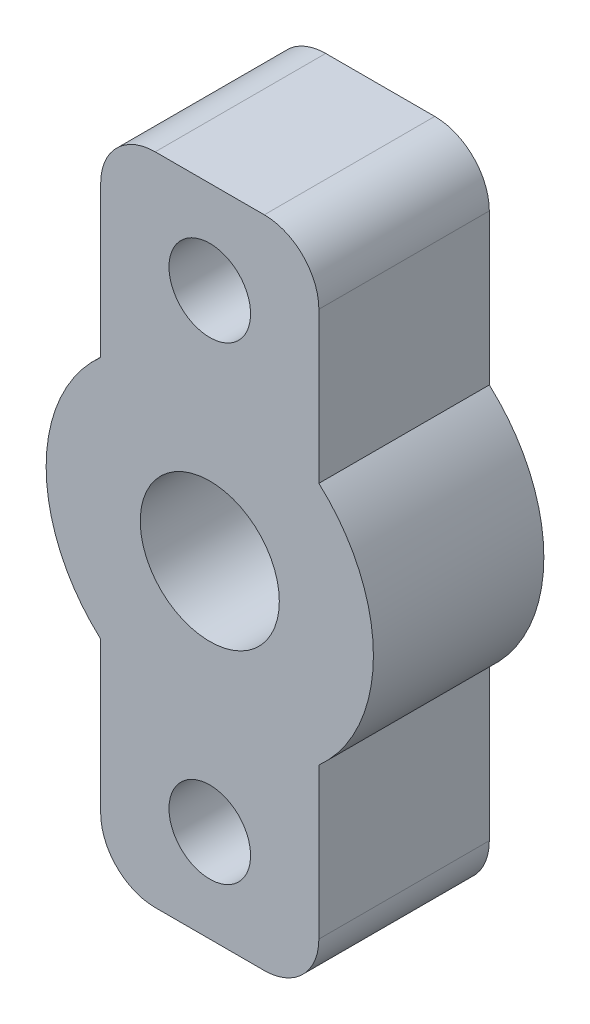
ISO-10303-21;
HEADER;
FILE_DESCRIPTION(('STEP AP214'),'2;1');
FILE_NAME('part.step','',(''),(''),'','','');
FILE_SCHEMA(('AUTOMOTIVE_DESIGN { 1 0 10303 214 1 1 1 1 }'));
ENDSEC;
DATA;
#1=APPLICATION_CONTEXT('core data for automotive mechanical design processes');
#2=APPLICATION_PROTOCOL_DEFINITION('international standard','automotive_design',2000,#1);
#3=PRODUCT_CONTEXT('',#1,'mechanical');
#4=PRODUCT('Part','Part','',(#3));
#5=PRODUCT_RELATED_PRODUCT_CATEGORY('part','',(#4));
#6=PRODUCT_DEFINITION_FORMATION('','',#4);
#7=PRODUCT_DEFINITION_CONTEXT('part definition',#1,'design');
#8=PRODUCT_DEFINITION('design','',#6,#7);
#9=PRODUCT_DEFINITION_SHAPE('','',#8);
#10=(LENGTH_UNIT() NAMED_UNIT(*) SI_UNIT(.MILLI.,.METRE.));
#11=(NAMED_UNIT(*) PLANE_ANGLE_UNIT() SI_UNIT($,.RADIAN.));
#12=(NAMED_UNIT(*) SI_UNIT($,.STERADIAN.) SOLID_ANGLE_UNIT());
#13=UNCERTAINTY_MEASURE_WITH_UNIT(LENGTH_MEASURE(1.E-05),#10,'distance_accuracy_value','');
#14=(GEOMETRIC_REPRESENTATION_CONTEXT(3) GLOBAL_UNCERTAINTY_ASSIGNED_CONTEXT((#13)) GLOBAL_UNIT_ASSIGNED_CONTEXT((#10,
#11,#12)) REPRESENTATION_CONTEXT('',''));
#15=CARTESIAN_POINT('',(0.,0.,0.));
#16=DIRECTION('',(0.,0.,1.));
#17=DIRECTION('',(1.,0.,0.));
#18=AXIS2_PLACEMENT_3D('',#15,#16,#17);
#19=CARTESIAN_POINT('',(2.54,12.7,7.9375));
#20=DIRECTION('',(0.,0.,1.));
#21=DIRECTION('',(1.,0.,0.));
#22=AXIS2_PLACEMENT_3D('',#19,#20,#21);
#23=PLANE('',#22);
#24=CARTESIAN_POINT('',(0.,0.,7.9375));
#25=DIRECTION('',(0.,0.,1.));
#26=DIRECTION('',(1.,0.,0.));
#27=AXIS2_PLACEMENT_3D('',#24,#25,#26);
#28=CIRCLE('',#27,3.2385);
#29=CARTESIAN_POINT('',(3.2385,0.,7.9375));
#30=VERTEX_POINT('',#29);
#31=EDGE_CURVE('E283',#30,#30,#28,.T.);
#32=ORIENTED_EDGE('',*,*,#31,.F.);
#33=EDGE_LOOP('',(#32));
#34=FACE_BOUND('',#33,.T.);
#35=CARTESIAN_POINT('',(2.54,12.7,7.9375));
#36=DIRECTION('',(0.,0.,1.));
#37=DIRECTION('',(1.,0.,0.));
#38=AXIS2_PLACEMENT_3D('',#35,#36,#37);
#39=CIRCLE('',#38,2.54);
#40=CARTESIAN_POINT('',(5.08,12.7,7.9375));
#41=VERTEX_POINT('',#40);
#42=CARTESIAN_POINT('',(2.53999999999998,15.24,7.9375));
#43=VERTEX_POINT('',#42);
#44=EDGE_CURVE('E180',#41,#43,#39,.T.);
#45=ORIENTED_EDGE('',*,*,#44,.T.);
#46=DIRECTION('',(-1.,0.,0.));
#47=VECTOR('',#46,1.);
#48=CARTESIAN_POINT('',(-2.53999999999998,15.24,7.9375));
#49=LINE('',#48,#47);
#50=CARTESIAN_POINT('',(-2.53999999999998,15.24,7.9375));
#51=VERTEX_POINT('',#50);
#52=EDGE_CURVE('E108',#43,#51,#49,.T.);
#53=ORIENTED_EDGE('',*,*,#52,.T.);
#54=CARTESIAN_POINT('',(-2.54,12.7,7.9375));
#55=DIRECTION('',(0.,0.,1.));
#56=DIRECTION('',(1.,0.,0.));
#57=AXIS2_PLACEMENT_3D('',#54,#55,#56);
#58=CIRCLE('',#57,2.54);
#59=CARTESIAN_POINT('',(-5.08,12.7,7.9375));
#60=VERTEX_POINT('',#59);
#61=EDGE_CURVE('E207',#51,#60,#58,.T.);
#62=ORIENTED_EDGE('',*,*,#61,.T.);
#63=DIRECTION('',(0.,-1.,0.));
#64=VECTOR('',#63,1.);
#65=CARTESIAN_POINT('',(-5.08,12.7,7.9375));
#66=LINE('',#65,#64);
#67=CARTESIAN_POINT('',(-5.08,5.67961266284947,7.9375));
#68=VERTEX_POINT('',#67);
#69=EDGE_CURVE('E226',#60,#68,#66,.T.);
#70=ORIENTED_EDGE('',*,*,#69,.T.);
#71=CARTESIAN_POINT('',(0.,0.,7.9375));
#72=DIRECTION('',(0.,0.,1.));
#73=DIRECTION('',(1.,0.,0.));
#74=AXIS2_PLACEMENT_3D('',#71,#72,#73);
#75=CIRCLE('',#74,7.62);
#76=CARTESIAN_POINT('',(-5.07999999999999,-5.67961266284947,7.9375));
#77=VERTEX_POINT('',#76);
#78=EDGE_CURVE('E223',#68,#77,#75,.T.);
#79=ORIENTED_EDGE('',*,*,#78,.T.);
#80=DIRECTION('',(0.,-1.,0.));
#81=VECTOR('',#80,1.);
#82=CARTESIAN_POINT('',(-5.08,-12.7,7.9375));
#83=LINE('',#82,#81);
#84=CARTESIAN_POINT('',(-5.08,-12.7,7.9375));
#85=VERTEX_POINT('',#84);
#86=EDGE_CURVE('E225',#77,#85,#83,.T.);
#87=ORIENTED_EDGE('',*,*,#86,.T.);
#88=CARTESIAN_POINT('',(-2.54,-12.7,7.9375));
#89=DIRECTION('',(0.,0.,1.));
#90=DIRECTION('',(-1.,0.,0.));
#91=AXIS2_PLACEMENT_3D('',#88,#89,#90);
#92=CIRCLE('',#91,2.54);
#93=CARTESIAN_POINT('',(-2.53999999999998,-15.24,7.9375));
#94=VERTEX_POINT('',#93);
#95=EDGE_CURVE('E228',#85,#94,#92,.T.);
#96=ORIENTED_EDGE('',*,*,#95,.T.);
#97=DIRECTION('',(1.,0.,0.));
#98=VECTOR('',#97,1.);
#99=CARTESIAN_POINT('',(-2.53999999999998,-15.24,7.9375));
#100=LINE('',#99,#98);
#101=CARTESIAN_POINT('',(2.53999999999998,-15.24,7.9375));
#102=VERTEX_POINT('',#101);
#103=EDGE_CURVE('E234',#94,#102,#100,.T.);
#104=ORIENTED_EDGE('',*,*,#103,.T.);
#105=CARTESIAN_POINT('',(2.54,-12.7,7.9375));
#106=DIRECTION('',(0.,0.,1.));
#107=DIRECTION('',(-1.,0.,0.));
#108=AXIS2_PLACEMENT_3D('',#105,#106,#107);
#109=CIRCLE('',#108,2.54);
#110=CARTESIAN_POINT('',(5.08,-12.7,7.9375));
#111=VERTEX_POINT('',#110);
#112=EDGE_CURVE('E139',#102,#111,#109,.T.);
#113=ORIENTED_EDGE('',*,*,#112,.T.);
#114=DIRECTION('',(0.,1.,0.));
#115=VECTOR('',#114,1.);
#116=CARTESIAN_POINT('',(5.08,-12.7,7.9375));
#117=LINE('',#116,#115);
#118=CARTESIAN_POINT('',(5.08,-5.67961266284946,7.9375));
#119=VERTEX_POINT('',#118);
#120=EDGE_CURVE('E133',#111,#119,#117,.T.);
#121=ORIENTED_EDGE('',*,*,#120,.T.);
#122=CARTESIAN_POINT('',(0.,0.,7.9375));
#123=DIRECTION('',(0.,0.,1.));
#124=DIRECTION('',(1.,0.,0.));
#125=AXIS2_PLACEMENT_3D('',#122,#123,#124);
#126=CIRCLE('',#125,7.62);
#127=CARTESIAN_POINT('',(5.08,5.67961266284946,7.9375));
#128=VERTEX_POINT('',#127);
#129=EDGE_CURVE('E137',#119,#128,#126,.T.);
#130=ORIENTED_EDGE('',*,*,#129,.T.);
#131=DIRECTION('',(0.,1.,0.));
#132=VECTOR('',#131,1.);
#133=CARTESIAN_POINT('',(5.08,12.7,7.9375));
#134=LINE('',#133,#132);
#135=EDGE_CURVE('E53',#128,#41,#134,.T.);
#136=ORIENTED_EDGE('',*,*,#135,.T.);
#137=EDGE_LOOP('',(#45,#53,#62,#70,#79,#87,#96,#104,#113,#121,#130,#136));
#138=FACE_BOUND('',#137,.T.);
#139=CARTESIAN_POINT('',(0.,10.922,7.9375));
#140=DIRECTION('',(0.,0.,-1.));
#141=DIRECTION('',(-1.,0.,0.));
#142=AXIS2_PLACEMENT_3D('',#139,#140,#141);
#143=CIRCLE('',#142,1.9);
#144=CARTESIAN_POINT('',(-1.9,10.922,7.9375));
#145=VERTEX_POINT('',#144);
#146=EDGE_CURVE('E161',#145,#145,#143,.T.);
#147=ORIENTED_EDGE('',*,*,#146,.T.);
#148=EDGE_LOOP('',(#147));
#149=FACE_BOUND('',#148,.T.);
#150=CARTESIAN_POINT('',(0.,-10.922,7.9375));
#151=DIRECTION('',(0.,0.,1.));
#152=DIRECTION('',(-1.,0.,0.));
#153=AXIS2_PLACEMENT_3D('',#150,#151,#152);
#154=CIRCLE('',#153,1.9);
#155=CARTESIAN_POINT('',(-1.9,-10.922,7.9375));
#156=VERTEX_POINT('',#155);
#157=EDGE_CURVE('E288',#156,#156,#154,.T.);
#158=ORIENTED_EDGE('',*,*,#157,.F.);
#159=EDGE_LOOP('',(#158));
#160=FACE_BOUND('',#159,.T.);
#161=ADVANCED_FACE('F36',(#34,#138,#149,#160),#23,.T.);
#162=CARTESIAN_POINT('',(2.54,12.7,0.));
#163=DIRECTION('',(0.,0.,1.));
#164=DIRECTION('',(1.,0.,0.));
#165=AXIS2_PLACEMENT_3D('',#162,#163,#164);
#166=PLANE('',#165);
#167=CARTESIAN_POINT('',(0.,0.,0.));
#168=DIRECTION('',(0.,0.,1.));
#169=DIRECTION('',(1.,0.,0.));
#170=AXIS2_PLACEMENT_3D('',#167,#168,#169);
#171=CIRCLE('',#170,3.2385);
#172=CARTESIAN_POINT('',(3.2385,0.,0.));
#173=VERTEX_POINT('',#172);
#174=EDGE_CURVE('E281',#173,#173,#171,.T.);
#175=ORIENTED_EDGE('',*,*,#174,.T.);
#176=EDGE_LOOP('',(#175));
#177=FACE_BOUND('',#176,.T.);
#178=CARTESIAN_POINT('',(0.,10.922,0.));
#179=DIRECTION('',(0.,0.,-1.));
#180=DIRECTION('',(-1.,0.,0.));
#181=AXIS2_PLACEMENT_3D('',#178,#179,#180);
#182=CIRCLE('',#181,1.9);
#183=CARTESIAN_POINT('',(-1.9,10.922,0.));
#184=VERTEX_POINT('',#183);
#185=EDGE_CURVE('E291',#184,#184,#182,.T.);
#186=ORIENTED_EDGE('',*,*,#185,.F.);
#187=EDGE_LOOP('',(#186));
#188=FACE_BOUND('',#187,.T.);
#189=CARTESIAN_POINT('',(2.54,12.7,0.));
#190=DIRECTION('',(0.,0.,1.));
#191=DIRECTION('',(1.,0.,0.));
#192=AXIS2_PLACEMENT_3D('',#189,#190,#191);
#193=CIRCLE('',#192,2.54);
#194=CARTESIAN_POINT('',(5.08,12.7,0.));
#195=VERTEX_POINT('',#194);
#196=CARTESIAN_POINT('',(2.53999999999998,15.24,0.));
#197=VERTEX_POINT('',#196);
#198=EDGE_CURVE('E157',#195,#197,#193,.T.);
#199=ORIENTED_EDGE('',*,*,#198,.F.);
#200=DIRECTION('',(0.,1.,0.));
#201=VECTOR('',#200,1.);
#202=CARTESIAN_POINT('',(5.08,12.7,0.));
#203=LINE('',#202,#201);
#204=CARTESIAN_POINT('',(5.08,5.67961266284946,0.));
#205=VERTEX_POINT('',#204);
#206=EDGE_CURVE('E100',#205,#195,#203,.T.);
#207=ORIENTED_EDGE('',*,*,#206,.F.);
#208=CARTESIAN_POINT('',(0.,0.,0.));
#209=DIRECTION('',(0.,0.,1.));
#210=DIRECTION('',(1.,0.,0.));
#211=AXIS2_PLACEMENT_3D('',#208,#209,#210);
#212=CIRCLE('',#211,7.62);
#213=CARTESIAN_POINT('',(5.08,-5.67961266284946,0.));
#214=VERTEX_POINT('',#213);
#215=EDGE_CURVE('E94',#214,#205,#212,.T.);
#216=ORIENTED_EDGE('',*,*,#215,.F.);
#217=DIRECTION('',(0.,1.,0.));
#218=VECTOR('',#217,1.);
#219=CARTESIAN_POINT('',(5.08,-12.7,0.));
#220=LINE('',#219,#218);
#221=CARTESIAN_POINT('',(5.08,-12.7,0.));
#222=VERTEX_POINT('',#221);
#223=EDGE_CURVE('E147',#222,#214,#220,.T.);
#224=ORIENTED_EDGE('',*,*,#223,.F.);
#225=CARTESIAN_POINT('',(2.54,-12.7,0.));
#226=DIRECTION('',(0.,0.,1.));
#227=DIRECTION('',(-1.,0.,0.));
#228=AXIS2_PLACEMENT_3D('',#225,#226,#227);
#229=CIRCLE('',#228,2.54);
#230=CARTESIAN_POINT('',(2.53999999999998,-15.24,0.));
#231=VERTEX_POINT('',#230);
#232=EDGE_CURVE('E175',#231,#222,#229,.T.);
#233=ORIENTED_EDGE('',*,*,#232,.F.);
#234=DIRECTION('',(1.,0.,0.));
#235=VECTOR('',#234,1.);
#236=CARTESIAN_POINT('',(-2.53999999999998,-15.24,0.));
#237=LINE('',#236,#235);
#238=CARTESIAN_POINT('',(-2.53999999999998,-15.24,0.));
#239=VERTEX_POINT('',#238);
#240=EDGE_CURVE('E173',#239,#231,#237,.T.);
#241=ORIENTED_EDGE('',*,*,#240,.F.);
#242=CARTESIAN_POINT('',(-2.54,-12.7,0.));
#243=DIRECTION('',(0.,0.,1.));
#244=DIRECTION('',(-1.,0.,0.));
#245=AXIS2_PLACEMENT_3D('',#242,#243,#244);
#246=CIRCLE('',#245,2.54);
#247=CARTESIAN_POINT('',(-5.08,-12.7,0.));
#248=VERTEX_POINT('',#247);
#249=EDGE_CURVE('E171',#248,#239,#246,.T.);
#250=ORIENTED_EDGE('',*,*,#249,.F.);
#251=DIRECTION('',(0.,-1.,0.));
#252=VECTOR('',#251,1.);
#253=CARTESIAN_POINT('',(-5.08,-12.7,0.));
#254=LINE('',#253,#252);
#255=CARTESIAN_POINT('',(-5.07999999999999,-5.67961266284947,0.));
#256=VERTEX_POINT('',#255);
#257=EDGE_CURVE('E169',#256,#248,#254,.T.);
#258=ORIENTED_EDGE('',*,*,#257,.F.);
#259=CARTESIAN_POINT('',(0.,0.,0.));
#260=DIRECTION('',(0.,0.,1.));
#261=DIRECTION('',(1.,0.,0.));
#262=AXIS2_PLACEMENT_3D('',#259,#260,#261);
#263=CIRCLE('',#262,7.62);
#264=CARTESIAN_POINT('',(-5.08,5.67961266284947,0.));
#265=VERTEX_POINT('',#264);
#266=EDGE_CURVE('E167',#265,#256,#263,.T.);
#267=ORIENTED_EDGE('',*,*,#266,.F.);
#268=DIRECTION('',(0.,-1.,0.));
#269=VECTOR('',#268,1.);
#270=CARTESIAN_POINT('',(-5.08,12.7,0.));
#271=LINE('',#270,#269);
#272=CARTESIAN_POINT('',(-5.08,12.7,0.));
#273=VERTEX_POINT('',#272);
#274=EDGE_CURVE('E165',#273,#265,#271,.T.);
#275=ORIENTED_EDGE('',*,*,#274,.F.);
#276=CARTESIAN_POINT('',(-2.54,12.7,0.));
#277=DIRECTION('',(0.,0.,1.));
#278=DIRECTION('',(1.,0.,0.));
#279=AXIS2_PLACEMENT_3D('',#276,#277,#278);
#280=CIRCLE('',#279,2.54);
#281=CARTESIAN_POINT('',(-2.53999999999998,15.24,0.));
#282=VERTEX_POINT('',#281);
#283=EDGE_CURVE('E163',#282,#273,#280,.T.);
#284=ORIENTED_EDGE('',*,*,#283,.F.);
#285=DIRECTION('',(-1.,0.,0.));
#286=VECTOR('',#285,1.);
#287=CARTESIAN_POINT('',(-2.53999999999998,15.24,0.));
#288=LINE('',#287,#286);
#289=EDGE_CURVE('E160',#197,#282,#288,.T.);
#290=ORIENTED_EDGE('',*,*,#289,.F.);
#291=EDGE_LOOP('',(#199,#207,#216,#224,#233,#241,#250,#258,#267,#275,#284,#290));
#292=FACE_BOUND('',#291,.T.);
#293=CARTESIAN_POINT('',(0.,-10.922,0.));
#294=DIRECTION('',(0.,0.,1.));
#295=DIRECTION('',(-1.,0.,0.));
#296=AXIS2_PLACEMENT_3D('',#293,#294,#295);
#297=CIRCLE('',#296,1.9);
#298=CARTESIAN_POINT('',(-1.9,-10.922,0.));
#299=VERTEX_POINT('',#298);
#300=EDGE_CURVE('E285',#299,#299,#297,.T.);
#301=ORIENTED_EDGE('',*,*,#300,.T.);
#302=EDGE_LOOP('',(#301));
#303=FACE_BOUND('',#302,.T.);
#304=ADVANCED_FACE('F211',(#177,#188,#292,#303),#166,.F.);
#305=CARTESIAN_POINT('',(2.54,12.7,7.9375));
#306=DIRECTION('',(0.,0.,-1.));
#307=DIRECTION('',(-1.,0.,0.));
#308=AXIS2_PLACEMENT_3D('',#305,#306,#307);
#309=CYLINDRICAL_SURFACE('',#308,2.54);
#310=ORIENTED_EDGE('',*,*,#198,.T.);
#311=DIRECTION('',(0.,0.,-1.));
#312=VECTOR('',#311,1.);
#313=CARTESIAN_POINT('',(2.53999999999998,15.24,7.9375));
#314=LINE('',#313,#312);
#315=EDGE_CURVE('E11',#43,#197,#314,.T.);
#316=ORIENTED_EDGE('',*,*,#315,.F.);
#317=ORIENTED_EDGE('',*,*,#44,.F.);
#318=DIRECTION('',(0.,0.,-1.));
#319=VECTOR('',#318,1.);
#320=CARTESIAN_POINT('',(5.08,12.7,7.9375));
#321=LINE('',#320,#319);
#322=EDGE_CURVE('E153',#41,#195,#321,.T.);
#323=ORIENTED_EDGE('',*,*,#322,.T.);
#324=EDGE_LOOP('',(#310,#316,#317,#323));
#325=FACE_BOUND('',#324,.T.);
#326=ADVANCED_FACE('F38',(#325),#309,.T.);
#327=CARTESIAN_POINT('',(-2.53999999999998,15.24,7.9375));
#328=DIRECTION('',(0.,-1.,0.));
#329=DIRECTION('',(0.,0.,-1.));
#330=AXIS2_PLACEMENT_3D('',#327,#328,#329);
#331=PLANE('',#330);
#332=ORIENTED_EDGE('',*,*,#289,.T.);
#333=DIRECTION('',(0.,0.,-1.));
#334=VECTOR('',#333,1.);
#335=CARTESIAN_POINT('',(-2.53999999999998,15.24,7.9375));
#336=LINE('',#335,#334);
#337=EDGE_CURVE('E45',#51,#282,#336,.T.);
#338=ORIENTED_EDGE('',*,*,#337,.F.);
#339=ORIENTED_EDGE('',*,*,#52,.F.);
#340=ORIENTED_EDGE('',*,*,#315,.T.);
#341=EDGE_LOOP('',(#332,#338,#339,#340));
#342=FACE_BOUND('',#341,.T.);
#343=ADVANCED_FACE('F396',(#342),#331,.F.);
#344=CARTESIAN_POINT('',(-2.54,12.7,7.9375));
#345=DIRECTION('',(0.,0.,-1.));
#346=DIRECTION('',(-1.,0.,0.));
#347=AXIS2_PLACEMENT_3D('',#344,#345,#346);
#348=CYLINDRICAL_SURFACE('',#347,2.54);
#349=ORIENTED_EDGE('',*,*,#283,.T.);
#350=DIRECTION('',(0.,0.,-1.));
#351=VECTOR('',#350,1.);
#352=CARTESIAN_POINT('',(-5.08,12.7,7.9375));
#353=LINE('',#352,#351);
#354=EDGE_CURVE('E199',#60,#273,#353,.T.);
#355=ORIENTED_EDGE('',*,*,#354,.F.);
#356=ORIENTED_EDGE('',*,*,#61,.F.);
#357=ORIENTED_EDGE('',*,*,#337,.T.);
#358=EDGE_LOOP('',(#349,#355,#356,#357));
#359=FACE_BOUND('',#358,.T.);
#360=ADVANCED_FACE('F205',(#359),#348,.T.);
#361=CARTESIAN_POINT('',(-5.08,12.7,7.9375));
#362=DIRECTION('',(1.,0.,0.));
#363=DIRECTION('',(0.,1.,0.));
#364=AXIS2_PLACEMENT_3D('',#361,#362,#363);
#365=PLANE('',#364);
#366=ORIENTED_EDGE('',*,*,#274,.T.);
#367=DIRECTION('',(0.,0.,-1.));
#368=VECTOR('',#367,1.);
#369=CARTESIAN_POINT('',(-5.08,5.67961266284947,7.9375));
#370=LINE('',#369,#368);
#371=EDGE_CURVE('E196',#68,#265,#370,.T.);
#372=ORIENTED_EDGE('',*,*,#371,.F.);
#373=ORIENTED_EDGE('',*,*,#69,.F.);
#374=ORIENTED_EDGE('',*,*,#354,.T.);
#375=EDGE_LOOP('',(#366,#372,#373,#374));
#376=FACE_BOUND('',#375,.T.);
#377=ADVANCED_FACE('F217',(#376),#365,.F.);
#378=CARTESIAN_POINT('',(0.,0.,7.9375));
#379=DIRECTION('',(0.,0.,-1.));
#380=DIRECTION('',(-1.,0.,0.));
#381=AXIS2_PLACEMENT_3D('',#378,#379,#380);
#382=CYLINDRICAL_SURFACE('',#381,7.62);
#383=ORIENTED_EDGE('',*,*,#266,.T.);
#384=DIRECTION('',(0.,0.,-1.));
#385=VECTOR('',#384,1.);
#386=CARTESIAN_POINT('',(-5.07999999999999,-5.67961266284947,7.9375));
#387=LINE('',#386,#385);
#388=EDGE_CURVE('E193',#77,#256,#387,.T.);
#389=ORIENTED_EDGE('',*,*,#388,.F.);
#390=ORIENTED_EDGE('',*,*,#78,.F.);
#391=ORIENTED_EDGE('',*,*,#371,.T.);
#392=EDGE_LOOP('',(#383,#389,#390,#391));
#393=FACE_BOUND('',#392,.T.);
#394=ADVANCED_FACE('F221',(#393),#382,.T.);
#395=CARTESIAN_POINT('',(-5.08,-12.7,7.9375));
#396=DIRECTION('',(1.,0.,0.));
#397=DIRECTION('',(0.,1.,0.));
#398=AXIS2_PLACEMENT_3D('',#395,#396,#397);
#399=PLANE('',#398);
#400=ORIENTED_EDGE('',*,*,#257,.T.);
#401=DIRECTION('',(0.,0.,-1.));
#402=VECTOR('',#401,1.);
#403=CARTESIAN_POINT('',(-5.08,-12.7,7.9375));
#404=LINE('',#403,#402);
#405=EDGE_CURVE('E190',#85,#248,#404,.T.);
#406=ORIENTED_EDGE('',*,*,#405,.F.);
#407=ORIENTED_EDGE('',*,*,#86,.F.);
#408=ORIENTED_EDGE('',*,*,#388,.T.);
#409=EDGE_LOOP('',(#400,#406,#407,#408));
#410=FACE_BOUND('',#409,.T.);
#411=ADVANCED_FACE('F361',(#410),#399,.F.);
#412=CARTESIAN_POINT('',(-2.54,-12.7,7.9375));
#413=DIRECTION('',(0.,0.,-1.));
#414=DIRECTION('',(-1.,0.,0.));
#415=AXIS2_PLACEMENT_3D('',#412,#413,#414);
#416=CYLINDRICAL_SURFACE('',#415,2.54);
#417=ORIENTED_EDGE('',*,*,#249,.T.);
#418=DIRECTION('',(0.,0.,-1.));
#419=VECTOR('',#418,1.);
#420=CARTESIAN_POINT('',(-2.53999999999998,-15.24,7.9375));
#421=LINE('',#420,#419);
#422=EDGE_CURVE('E187',#94,#239,#421,.T.);
#423=ORIENTED_EDGE('',*,*,#422,.F.);
#424=ORIENTED_EDGE('',*,*,#95,.F.);
#425=ORIENTED_EDGE('',*,*,#405,.T.);
#426=EDGE_LOOP('',(#417,#423,#424,#425));
#427=FACE_BOUND('',#426,.T.);
#428=ADVANCED_FACE('F352',(#427),#416,.T.);
#429=CARTESIAN_POINT('',(-2.53999999999998,-15.24,7.9375));
#430=DIRECTION('',(0.,1.,0.));
#431=DIRECTION('',(0.,0.,1.));
#432=AXIS2_PLACEMENT_3D('',#429,#430,#431);
#433=PLANE('',#432);
#434=ORIENTED_EDGE('',*,*,#240,.T.);
#435=DIRECTION('',(0.,0.,-1.));
#436=VECTOR('',#435,1.);
#437=CARTESIAN_POINT('',(2.53999999999998,-15.24,7.9375));
#438=LINE('',#437,#436);
#439=EDGE_CURVE('E184',#102,#231,#438,.T.);
#440=ORIENTED_EDGE('',*,*,#439,.F.);
#441=ORIENTED_EDGE('',*,*,#103,.F.);
#442=ORIENTED_EDGE('',*,*,#422,.T.);
#443=EDGE_LOOP('',(#434,#440,#441,#442));
#444=FACE_BOUND('',#443,.T.);
#445=ADVANCED_FACE('F240',(#444),#433,.F.);
#446=CARTESIAN_POINT('',(2.54,-12.7,7.9375));
#447=DIRECTION('',(0.,0.,-1.));
#448=DIRECTION('',(-1.,0.,0.));
#449=AXIS2_PLACEMENT_3D('',#446,#447,#448);
#450=CYLINDRICAL_SURFACE('',#449,2.54);
#451=ORIENTED_EDGE('',*,*,#232,.T.);
#452=DIRECTION('',(0.,0.,-1.));
#453=VECTOR('',#452,1.);
#454=CARTESIAN_POINT('',(5.08,-12.7,7.9375));
#455=LINE('',#454,#453);
#456=EDGE_CURVE('E148',#111,#222,#455,.T.);
#457=ORIENTED_EDGE('',*,*,#456,.F.);
#458=ORIENTED_EDGE('',*,*,#112,.F.);
#459=ORIENTED_EDGE('',*,*,#439,.T.);
#460=EDGE_LOOP('',(#451,#457,#458,#459));
#461=FACE_BOUND('',#460,.T.);
#462=ADVANCED_FACE('F244',(#461),#450,.T.);
#463=CARTESIAN_POINT('',(5.08,-12.7,7.9375));
#464=DIRECTION('',(-1.,0.,0.));
#465=DIRECTION('',(0.,-1.,0.));
#466=AXIS2_PLACEMENT_3D('',#463,#464,#465);
#467=PLANE('',#466);
#468=ORIENTED_EDGE('',*,*,#223,.T.);
#469=DIRECTION('',(0.,0.,-1.));
#470=VECTOR('',#469,1.);
#471=CARTESIAN_POINT('',(5.08,-5.67961266284946,7.9375));
#472=LINE('',#471,#470);
#473=EDGE_CURVE('E144',#119,#214,#472,.T.);
#474=ORIENTED_EDGE('',*,*,#473,.F.);
#475=ORIENTED_EDGE('',*,*,#120,.F.);
#476=ORIENTED_EDGE('',*,*,#456,.T.);
#477=EDGE_LOOP('',(#468,#474,#475,#476));
#478=FACE_BOUND('',#477,.T.);
#479=ADVANCED_FACE('F145',(#478),#467,.F.);
#480=CARTESIAN_POINT('',(0.,0.,7.9375));
#481=DIRECTION('',(0.,0.,-1.));
#482=DIRECTION('',(-1.,0.,0.));
#483=AXIS2_PLACEMENT_3D('',#480,#481,#482);
#484=CYLINDRICAL_SURFACE('',#483,7.62);
#485=ORIENTED_EDGE('',*,*,#215,.T.);
#486=DIRECTION('',(0.,0.,-1.));
#487=VECTOR('',#486,1.);
#488=CARTESIAN_POINT('',(5.08,5.67961266284946,7.9375));
#489=LINE('',#488,#487);
#490=EDGE_CURVE('E149',#128,#205,#489,.T.);
#491=ORIENTED_EDGE('',*,*,#490,.F.);
#492=ORIENTED_EDGE('',*,*,#129,.F.);
#493=ORIENTED_EDGE('',*,*,#473,.T.);
#494=EDGE_LOOP('',(#485,#491,#492,#493));
#495=FACE_BOUND('',#494,.T.);
#496=ADVANCED_FACE('F151',(#495),#484,.T.);
#497=CARTESIAN_POINT('',(5.08,12.7,7.9375));
#498=DIRECTION('',(-1.,0.,0.));
#499=DIRECTION('',(0.,-1.,0.));
#500=AXIS2_PLACEMENT_3D('',#497,#498,#499);
#501=PLANE('',#500);
#502=ORIENTED_EDGE('',*,*,#206,.T.);
#503=ORIENTED_EDGE('',*,*,#322,.F.);
#504=ORIENTED_EDGE('',*,*,#135,.F.);
#505=ORIENTED_EDGE('',*,*,#490,.T.);
#506=EDGE_LOOP('',(#502,#503,#504,#505));
#507=FACE_BOUND('',#506,.T.);
#508=ADVANCED_FACE('F248',(#507),#501,.F.);
#509=CARTESIAN_POINT('',(0.,10.922,7.9375));
#510=DIRECTION('',(0.,0.,-1.));
#511=DIRECTION('',(-1.,0.,0.));
#512=AXIS2_PLACEMENT_3D('',#509,#510,#511);
#513=CYLINDRICAL_SURFACE('',#512,1.9);
#514=ORIENTED_EDGE('',*,*,#146,.F.);
#515=EDGE_LOOP('',(#514));
#516=FACE_BOUND('',#515,.T.);
#517=ORIENTED_EDGE('',*,*,#185,.T.);
#518=EDGE_LOOP('',(#517));
#519=FACE_BOUND('',#518,.T.);
#520=ADVANCED_FACE('F250',(#516,#519),#513,.F.);
#521=CARTESIAN_POINT('',(0.,-10.922,7.9375));
#522=DIRECTION('',(0.,0.,-1.));
#523=DIRECTION('',(-1.,0.,0.));
#524=AXIS2_PLACEMENT_3D('',#521,#522,#523);
#525=CYLINDRICAL_SURFACE('',#524,1.9);
#526=ORIENTED_EDGE('',*,*,#157,.T.);
#527=EDGE_LOOP('',(#526));
#528=FACE_BOUND('',#527,.T.);
#529=ORIENTED_EDGE('',*,*,#300,.F.);
#530=EDGE_LOOP('',(#529));
#531=FACE_BOUND('',#530,.T.);
#532=ADVANCED_FACE('F256',(#528,#531),#525,.F.);
#533=CARTESIAN_POINT('',(0.,0.,0.));
#534=DIRECTION('',(0.,0.,1.));
#535=DIRECTION('',(1.,0.,0.));
#536=AXIS2_PLACEMENT_3D('',#533,#534,#535);
#537=CYLINDRICAL_SURFACE('',#536,3.2385);
#538=ORIENTED_EDGE('',*,*,#174,.F.);
#539=EDGE_LOOP('',(#538));
#540=FACE_BOUND('',#539,.T.);
#541=ORIENTED_EDGE('',*,*,#31,.T.);
#542=EDGE_LOOP('',(#541));
#543=FACE_BOUND('',#542,.T.);
#544=ADVANCED_FACE('F272',(#540,#543),#537,.F.);
#545=CLOSED_SHELL('',(#161,#304,#326,#343,#360,#377,#394,#411,#428,#445,#462,#479,#496,#508,
#520,#532,#544));
#546=MANIFOLD_SOLID_BREP('B2',#545);
#547=ADVANCED_BREP_SHAPE_REPRESENTATION('',(#18,#546),#14);
#548=SHAPE_DEFINITION_REPRESENTATION(#9,#547);
ENDSEC;
END-ISO-10303-21;
